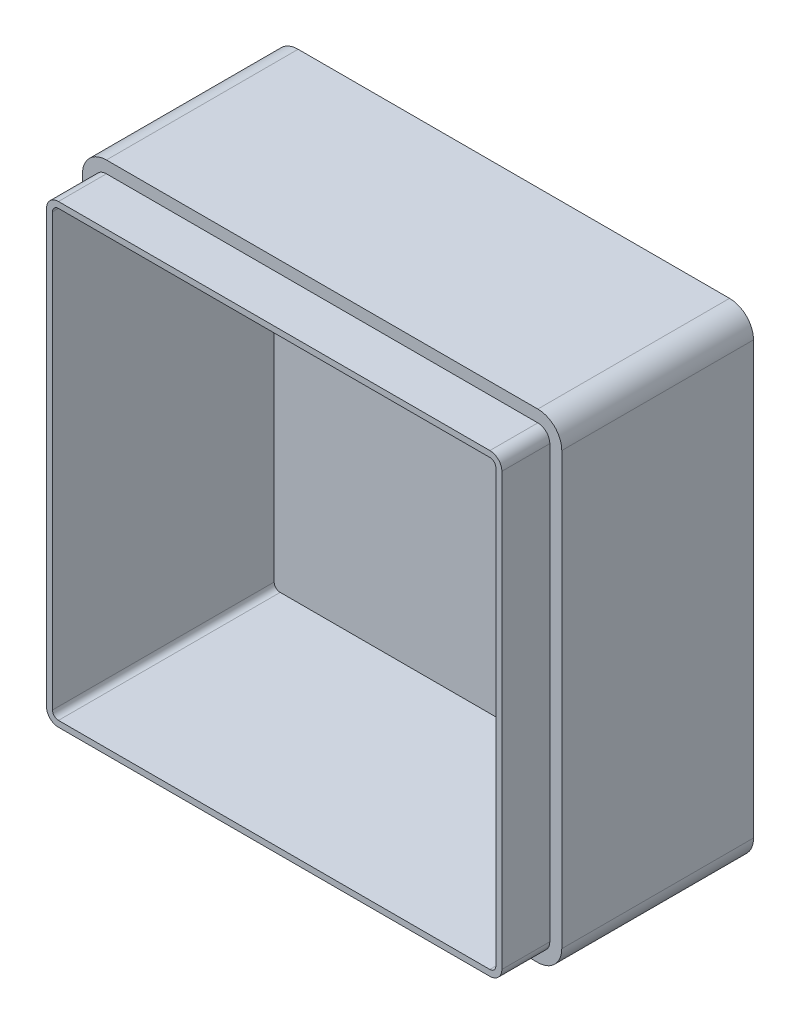
ISO-10303-21;
HEADER;
FILE_DESCRIPTION(('STEP AP214'),'2;1');
FILE_NAME('part.step','',(''),(''),'','','');
FILE_SCHEMA(('AUTOMOTIVE_DESIGN { 1 0 10303 214 1 1 1 1 }'));
ENDSEC;
DATA;
#1=APPLICATION_CONTEXT('core data for automotive mechanical design processes');
#2=APPLICATION_PROTOCOL_DEFINITION('international standard','automotive_design',2000,#1);
#3=PRODUCT_CONTEXT('',#1,'mechanical');
#4=PRODUCT('Part','Part','',(#3));
#5=PRODUCT_RELATED_PRODUCT_CATEGORY('part','',(#4));
#6=PRODUCT_DEFINITION_FORMATION('','',#4);
#7=PRODUCT_DEFINITION_CONTEXT('part definition',#1,'design');
#8=PRODUCT_DEFINITION('design','',#6,#7);
#9=PRODUCT_DEFINITION_SHAPE('','',#8);
#10=(LENGTH_UNIT() NAMED_UNIT(*) SI_UNIT(.MILLI.,.METRE.));
#11=(NAMED_UNIT(*) PLANE_ANGLE_UNIT() SI_UNIT($,.RADIAN.));
#12=(NAMED_UNIT(*) SI_UNIT($,.STERADIAN.) SOLID_ANGLE_UNIT());
#13=UNCERTAINTY_MEASURE_WITH_UNIT(LENGTH_MEASURE(1.E-05),#10,'distance_accuracy_value','');
#14=(GEOMETRIC_REPRESENTATION_CONTEXT(3) GLOBAL_UNCERTAINTY_ASSIGNED_CONTEXT((#13)) GLOBAL_UNIT_ASSIGNED_CONTEXT((#10,
#11,#12)) REPRESENTATION_CONTEXT('',''));
#15=CARTESIAN_POINT('',(0.,0.,0.));
#16=DIRECTION('',(0.,0.,1.));
#17=DIRECTION('',(1.,0.,0.));
#18=AXIS2_PLACEMENT_3D('',#15,#16,#17);
#19=CARTESIAN_POINT('',(0.,254.,127.));
#20=DIRECTION('',(0.,0.,-1.));
#21=DIRECTION('',(-1.,0.,0.));
#22=AXIS2_PLACEMENT_3D('',#19,#20,#21);
#23=PLANE('',#22);
#24=DIRECTION('',(0.,-1.,0.));
#25=VECTOR('',#24,1.);
#26=CARTESIAN_POINT('',(9.52499999999994,254.,127.));
#27=LINE('',#26,#25);
#28=CARTESIAN_POINT('',(9.52499999999995,241.3,127.));
#29=VERTEX_POINT('',#28);
#30=CARTESIAN_POINT('',(9.525,12.7,127.));
#31=VERTEX_POINT('',#30);
#32=EDGE_CURVE('E615',#29,#31,#27,.T.);
#33=ORIENTED_EDGE('',*,*,#32,.F.);
#34=CARTESIAN_POINT('',(12.6999999999999,241.3,127.));
#35=DIRECTION('',(0.,0.,-1.));
#36=DIRECTION('',(-1.,0.,0.));
#37=AXIS2_PLACEMENT_3D('',#34,#35,#36);
#38=CIRCLE('',#37,3.175);
#39=CARTESIAN_POINT('',(12.6999999999999,244.475,127.));
#40=VERTEX_POINT('',#39);
#41=EDGE_CURVE('E598',#40,#29,#38,.F.);
#42=ORIENTED_EDGE('',*,*,#41,.F.);
#43=DIRECTION('',(-1.,0.,0.));
#44=VECTOR('',#43,1.);
#45=CARTESIAN_POINT('',(0.,244.475,127.));
#46=LINE('',#45,#44);
#47=CARTESIAN_POINT('',(241.3,244.475,127.));
#48=VERTEX_POINT('',#47);
#49=EDGE_CURVE('E624',#48,#40,#46,.T.);
#50=ORIENTED_EDGE('',*,*,#49,.F.);
#51=CARTESIAN_POINT('',(241.3,241.3,127.));
#52=DIRECTION('',(0.,0.,-1.));
#53=DIRECTION('',(-1.,0.,0.));
#54=AXIS2_PLACEMENT_3D('',#51,#52,#53);
#55=CIRCLE('',#54,3.175);
#56=CARTESIAN_POINT('',(244.475,241.3,127.));
#57=VERTEX_POINT('',#56);
#58=EDGE_CURVE('E647',#57,#48,#55,.F.);
#59=ORIENTED_EDGE('',*,*,#58,.F.);
#60=DIRECTION('',(0.,1.,0.));
#61=VECTOR('',#60,1.);
#62=CARTESIAN_POINT('',(244.475,254.,127.));
#63=LINE('',#62,#61);
#64=CARTESIAN_POINT('',(244.475,12.7,127.));
#65=VERTEX_POINT('',#64);
#66=EDGE_CURVE('E645',#65,#57,#63,.T.);
#67=ORIENTED_EDGE('',*,*,#66,.F.);
#68=CARTESIAN_POINT('',(241.3,12.7,127.));
#69=DIRECTION('',(0.,0.,-1.));
#70=DIRECTION('',(-1.,0.,0.));
#71=AXIS2_PLACEMENT_3D('',#68,#69,#70);
#72=CIRCLE('',#71,3.175);
#73=CARTESIAN_POINT('',(241.3,9.525,127.));
#74=VERTEX_POINT('',#73);
#75=EDGE_CURVE('E642',#74,#65,#72,.F.);
#76=ORIENTED_EDGE('',*,*,#75,.F.);
#77=DIRECTION('',(1.,0.,0.));
#78=VECTOR('',#77,1.);
#79=CARTESIAN_POINT('',(0.,9.52500000000001,127.));
#80=LINE('',#79,#78);
#81=CARTESIAN_POINT('',(12.7,9.525,127.));
#82=VERTEX_POINT('',#81);
#83=EDGE_CURVE('E640',#82,#74,#80,.T.);
#84=ORIENTED_EDGE('',*,*,#83,.F.);
#85=CARTESIAN_POINT('',(12.7,12.7,127.));
#86=DIRECTION('',(0.,0.,-1.));
#87=DIRECTION('',(-1.,0.,0.));
#88=AXIS2_PLACEMENT_3D('',#85,#86,#87);
#89=CIRCLE('',#88,3.175);
#90=EDGE_CURVE('E631',#31,#82,#89,.F.);
#91=ORIENTED_EDGE('',*,*,#90,.F.);
#92=EDGE_LOOP('',(#33,#42,#50,#59,#67,#76,#84,#91));
#93=FACE_BOUND('',#92,.T.);
#94=CARTESIAN_POINT('',(12.6999999999999,241.3,127.));
#95=DIRECTION('',(0.,0.,1.));
#96=DIRECTION('',(1.,0.,0.));
#97=AXIS2_PLACEMENT_3D('',#94,#95,#96);
#98=CIRCLE('',#97,6.35);
#99=CARTESIAN_POINT('',(12.6999999999999,247.65,127.));
#100=VERTEX_POINT('',#99);
#101=CARTESIAN_POINT('',(6.34999999999995,241.3,127.));
#102=VERTEX_POINT('',#101);
#103=EDGE_CURVE('E530',#100,#102,#98,.T.);
#104=ORIENTED_EDGE('',*,*,#103,.T.);
#105=DIRECTION('',(0.,-1.,0.));
#106=VECTOR('',#105,1.);
#107=CARTESIAN_POINT('',(6.34999999999995,241.3,127.));
#108=LINE('',#107,#106);
#109=CARTESIAN_POINT('',(6.35,12.7,127.));
#110=VERTEX_POINT('',#109);
#111=EDGE_CURVE('E528',#102,#110,#108,.T.);
#112=ORIENTED_EDGE('',*,*,#111,.T.);
#113=CARTESIAN_POINT('',(12.7,12.7,127.));
#114=DIRECTION('',(0.,0.,1.));
#115=DIRECTION('',(1.,0.,0.));
#116=AXIS2_PLACEMENT_3D('',#113,#114,#115);
#117=CIRCLE('',#116,6.35);
#118=CARTESIAN_POINT('',(12.7,6.35,127.));
#119=VERTEX_POINT('',#118);
#120=EDGE_CURVE('E363',#110,#119,#117,.T.);
#121=ORIENTED_EDGE('',*,*,#120,.T.);
#122=DIRECTION('',(1.,0.,0.));
#123=VECTOR('',#122,1.);
#124=CARTESIAN_POINT('',(12.7,6.35,127.));
#125=LINE('',#124,#123);
#126=CARTESIAN_POINT('',(241.3,6.35,127.));
#127=VERTEX_POINT('',#126);
#128=EDGE_CURVE('E518',#119,#127,#125,.T.);
#129=ORIENTED_EDGE('',*,*,#128,.T.);
#130=CARTESIAN_POINT('',(241.3,12.7,127.));
#131=DIRECTION('',(0.,0.,1.));
#132=DIRECTION('',(1.,0.,0.));
#133=AXIS2_PLACEMENT_3D('',#130,#131,#132);
#134=CIRCLE('',#133,6.35);
#135=CARTESIAN_POINT('',(247.65,12.7,127.));
#136=VERTEX_POINT('',#135);
#137=EDGE_CURVE('E523',#127,#136,#134,.T.);
#138=ORIENTED_EDGE('',*,*,#137,.T.);
#139=DIRECTION('',(0.,1.,0.));
#140=VECTOR('',#139,1.);
#141=CARTESIAN_POINT('',(247.65,12.7,127.));
#142=LINE('',#141,#140);
#143=CARTESIAN_POINT('',(247.65,241.3,127.));
#144=VERTEX_POINT('',#143);
#145=EDGE_CURVE('E535',#136,#144,#142,.T.);
#146=ORIENTED_EDGE('',*,*,#145,.T.);
#147=CARTESIAN_POINT('',(241.3,241.3,127.));
#148=DIRECTION('',(0.,0.,1.));
#149=DIRECTION('',(1.,0.,0.));
#150=AXIS2_PLACEMENT_3D('',#147,#148,#149);
#151=CIRCLE('',#150,6.34999999999999);
#152=CARTESIAN_POINT('',(241.3,247.65,127.));
#153=VERTEX_POINT('',#152);
#154=EDGE_CURVE('E538',#144,#153,#151,.T.);
#155=ORIENTED_EDGE('',*,*,#154,.T.);
#156=DIRECTION('',(-1.,0.,0.));
#157=VECTOR('',#156,1.);
#158=CARTESIAN_POINT('',(241.3,247.65,127.));
#159=LINE('',#158,#157);
#160=EDGE_CURVE('E541',#153,#100,#159,.T.);
#161=ORIENTED_EDGE('',*,*,#160,.T.);
#162=EDGE_LOOP('',(#104,#112,#121,#129,#138,#146,#155,#161));
#163=FACE_BOUND('',#162,.T.);
#164=ADVANCED_FACE('F348',(#93,#163),#23,.F.);
#165=CARTESIAN_POINT('',(9.525,0.,127.));
#166=DIRECTION('',(1.,0.,0.));
#167=DIRECTION('',(0.,1.,0.));
#168=AXIS2_PLACEMENT_3D('',#165,#166,#167);
#169=PLANE('',#168);
#170=DIRECTION('',(0.,-1.,0.));
#171=VECTOR('',#170,1.);
#172=CARTESIAN_POINT('',(9.52499999999994,254.,9.525));
#173=LINE('',#172,#171);
#174=CARTESIAN_POINT('',(9.52499999999995,241.3,9.52500000000001));
#175=VERTEX_POINT('',#174);
#176=CARTESIAN_POINT('',(9.525,12.7,9.52500000000001));
#177=VERTEX_POINT('',#176);
#178=EDGE_CURVE('E592',#175,#177,#173,.T.);
#179=ORIENTED_EDGE('',*,*,#178,.F.);
#180=DIRECTION('',(0.,0.,1.));
#181=VECTOR('',#180,1.);
#182=CARTESIAN_POINT('',(9.52499999999995,241.3,127.));
#183=LINE('',#182,#181);
#184=EDGE_CURVE('E599',#29,#175,#183,.F.);
#185=ORIENTED_EDGE('',*,*,#184,.F.);
#186=ORIENTED_EDGE('',*,*,#32,.T.);
#187=DIRECTION('',(0.,0.,1.));
#188=VECTOR('',#187,1.);
#189=CARTESIAN_POINT('',(9.525,12.7,127.));
#190=LINE('',#189,#188);
#191=EDGE_CURVE('E596',#177,#31,#190,.T.);
#192=ORIENTED_EDGE('',*,*,#191,.F.);
#193=EDGE_LOOP('',(#179,#185,#186,#192));
#194=FACE_BOUND('',#193,.T.);
#195=ADVANCED_FACE('F741',(#194),#169,.T.);
#196=CARTESIAN_POINT('',(0.,9.525,127.));
#197=DIRECTION('',(0.,1.,0.));
#198=DIRECTION('',(0.,0.,1.));
#199=AXIS2_PLACEMENT_3D('',#196,#197,#198);
#200=PLANE('',#199);
#201=ORIENTED_EDGE('',*,*,#83,.T.);
#202=DIRECTION('',(0.,0.,1.));
#203=VECTOR('',#202,1.);
#204=CARTESIAN_POINT('',(241.3,9.525,127.));
#205=LINE('',#204,#203);
#206=CARTESIAN_POINT('',(241.3,9.525,9.52500000000001));
#207=VERTEX_POINT('',#206);
#208=EDGE_CURVE('E622',#207,#74,#205,.T.);
#209=ORIENTED_EDGE('',*,*,#208,.F.);
#210=DIRECTION('',(1.,0.,0.));
#211=VECTOR('',#210,1.);
#212=CARTESIAN_POINT('',(0.,9.52500000000001,9.525));
#213=LINE('',#212,#211);
#214=CARTESIAN_POINT('',(12.7,9.525,9.52500000000001));
#215=VERTEX_POINT('',#214);
#216=EDGE_CURVE('E595',#215,#207,#213,.T.);
#217=ORIENTED_EDGE('',*,*,#216,.F.);
#218=DIRECTION('',(0.,0.,1.));
#219=VECTOR('',#218,1.);
#220=CARTESIAN_POINT('',(12.7,9.525,127.));
#221=LINE('',#220,#219);
#222=EDGE_CURVE('E611',#82,#215,#221,.F.);
#223=ORIENTED_EDGE('',*,*,#222,.F.);
#224=EDGE_LOOP('',(#201,#209,#217,#223));
#225=FACE_BOUND('',#224,.T.);
#226=ADVANCED_FACE('F747',(#225),#200,.T.);
#227=CARTESIAN_POINT('',(244.475,0.,127.));
#228=DIRECTION('',(-1.,0.,0.));
#229=DIRECTION('',(0.,-1.,0.));
#230=AXIS2_PLACEMENT_3D('',#227,#228,#229);
#231=PLANE('',#230);
#232=ORIENTED_EDGE('',*,*,#66,.T.);
#233=DIRECTION('',(0.,0.,1.));
#234=VECTOR('',#233,1.);
#235=CARTESIAN_POINT('',(244.475,241.3,127.));
#236=LINE('',#235,#234);
#237=CARTESIAN_POINT('',(244.475,241.3,9.52500000000001));
#238=VERTEX_POINT('',#237);
#239=EDGE_CURVE('E629',#238,#57,#236,.T.);
#240=ORIENTED_EDGE('',*,*,#239,.F.);
#241=DIRECTION('',(0.,1.,0.));
#242=VECTOR('',#241,1.);
#243=CARTESIAN_POINT('',(244.475,254.,9.525));
#244=LINE('',#243,#242);
#245=CARTESIAN_POINT('',(244.475,12.7,9.52500000000001));
#246=VERTEX_POINT('',#245);
#247=EDGE_CURVE('E605',#246,#238,#244,.T.);
#248=ORIENTED_EDGE('',*,*,#247,.F.);
#249=DIRECTION('',(0.,0.,1.));
#250=VECTOR('',#249,1.);
#251=CARTESIAN_POINT('',(244.475,12.7,127.));
#252=LINE('',#251,#250);
#253=EDGE_CURVE('E625',#65,#246,#252,.F.);
#254=ORIENTED_EDGE('',*,*,#253,.F.);
#255=EDGE_LOOP('',(#232,#240,#248,#254));
#256=FACE_BOUND('',#255,.T.);
#257=ADVANCED_FACE('F789',(#256),#231,.T.);
#258=CARTESIAN_POINT('',(0.,244.475,127.));
#259=DIRECTION('',(0.,-1.,0.));
#260=DIRECTION('',(0.,0.,-1.));
#261=AXIS2_PLACEMENT_3D('',#258,#259,#260);
#262=PLANE('',#261);
#263=ORIENTED_EDGE('',*,*,#49,.T.);
#264=DIRECTION('',(0.,0.,-1.));
#265=VECTOR('',#264,1.);
#266=CARTESIAN_POINT('',(12.6999999999999,244.475,127.));
#267=LINE('',#266,#265);
#268=CARTESIAN_POINT('',(12.6999999999999,244.475,9.52500000000001));
#269=VERTEX_POINT('',#268);
#270=EDGE_CURVE('E628',#269,#40,#267,.F.);
#271=ORIENTED_EDGE('',*,*,#270,.F.);
#272=DIRECTION('',(-1.,0.,0.));
#273=VECTOR('',#272,1.);
#274=CARTESIAN_POINT('',(0.,244.475,9.525));
#275=LINE('',#274,#273);
#276=CARTESIAN_POINT('',(241.3,244.475,9.52500000000001));
#277=VERTEX_POINT('',#276);
#278=EDGE_CURVE('E612',#277,#269,#275,.T.);
#279=ORIENTED_EDGE('',*,*,#278,.F.);
#280=DIRECTION('',(0.,0.,-1.));
#281=VECTOR('',#280,1.);
#282=CARTESIAN_POINT('',(241.3,244.475,127.));
#283=LINE('',#282,#281);
#284=EDGE_CURVE('E632',#48,#277,#283,.T.);
#285=ORIENTED_EDGE('',*,*,#284,.F.);
#286=EDGE_LOOP('',(#263,#271,#279,#285));
#287=FACE_BOUND('',#286,.T.);
#288=ADVANCED_FACE('F785',(#287),#262,.T.);
#289=CARTESIAN_POINT('',(0.,254.,9.525));
#290=DIRECTION('',(0.,0.,-1.));
#291=DIRECTION('',(-1.,0.,0.));
#292=AXIS2_PLACEMENT_3D('',#289,#290,#291);
#293=PLANE('',#292);
#294=ORIENTED_EDGE('',*,*,#216,.T.);
#295=CARTESIAN_POINT('',(241.3,12.7,9.52500000000001));
#296=DIRECTION('',(0.,0.,-1.));
#297=DIRECTION('',(-1.,0.,0.));
#298=AXIS2_PLACEMENT_3D('',#295,#296,#297);
#299=CIRCLE('',#298,3.175);
#300=EDGE_CURVE('E607',#246,#207,#299,.T.);
#301=ORIENTED_EDGE('',*,*,#300,.F.);
#302=ORIENTED_EDGE('',*,*,#247,.T.);
#303=CARTESIAN_POINT('',(241.3,241.3,9.52500000000001));
#304=DIRECTION('',(0.,0.,-1.));
#305=DIRECTION('',(-1.,0.,0.));
#306=AXIS2_PLACEMENT_3D('',#303,#304,#305);
#307=CIRCLE('',#306,3.175);
#308=EDGE_CURVE('E610',#277,#238,#307,.T.);
#309=ORIENTED_EDGE('',*,*,#308,.F.);
#310=ORIENTED_EDGE('',*,*,#278,.T.);
#311=CARTESIAN_POINT('',(12.6999999999999,241.3,9.52500000000001));
#312=DIRECTION('',(0.,0.,-1.));
#313=DIRECTION('',(-1.,0.,0.));
#314=AXIS2_PLACEMENT_3D('',#311,#312,#313);
#315=CIRCLE('',#314,3.175);
#316=EDGE_CURVE('E608',#175,#269,#315,.T.);
#317=ORIENTED_EDGE('',*,*,#316,.F.);
#318=ORIENTED_EDGE('',*,*,#178,.T.);
#319=CARTESIAN_POINT('',(12.7,12.7,9.52500000000001));
#320=DIRECTION('',(0.,0.,-1.));
#321=DIRECTION('',(-1.,0.,0.));
#322=AXIS2_PLACEMENT_3D('',#319,#320,#321);
#323=CIRCLE('',#322,3.175);
#324=EDGE_CURVE('E602',#215,#177,#323,.T.);
#325=ORIENTED_EDGE('',*,*,#324,.F.);
#326=EDGE_LOOP('',(#294,#301,#302,#309,#310,#317,#318,#325));
#327=FACE_BOUND('',#326,.T.);
#328=ADVANCED_FACE('F781',(#327),#293,.F.);
#329=CARTESIAN_POINT('',(12.7,12.7,127.));
#330=DIRECTION('',(0.,0.,-1.));
#331=DIRECTION('',(-1.,0.,0.));
#332=AXIS2_PLACEMENT_3D('',#329,#330,#331);
#333=CYLINDRICAL_SURFACE('',#332,3.175);
#334=ORIENTED_EDGE('',*,*,#90,.T.);
#335=ORIENTED_EDGE('',*,*,#222,.T.);
#336=ORIENTED_EDGE('',*,*,#324,.T.);
#337=ORIENTED_EDGE('',*,*,#191,.T.);
#338=EDGE_LOOP('',(#334,#335,#336,#337));
#339=FACE_BOUND('',#338,.T.);
#340=ADVANCED_FACE('F777',(#339),#333,.F.);
#341=CARTESIAN_POINT('',(241.3,12.7,127.));
#342=DIRECTION('',(0.,0.,-1.));
#343=DIRECTION('',(-1.,0.,0.));
#344=AXIS2_PLACEMENT_3D('',#341,#342,#343);
#345=CYLINDRICAL_SURFACE('',#344,3.175);
#346=ORIENTED_EDGE('',*,*,#75,.T.);
#347=ORIENTED_EDGE('',*,*,#253,.T.);
#348=ORIENTED_EDGE('',*,*,#300,.T.);
#349=ORIENTED_EDGE('',*,*,#208,.T.);
#350=EDGE_LOOP('',(#346,#347,#348,#349));
#351=FACE_BOUND('',#350,.T.);
#352=ADVANCED_FACE('F773',(#351),#345,.F.);
#353=CARTESIAN_POINT('',(241.3,241.3,127.));
#354=DIRECTION('',(0.,0.,-1.));
#355=DIRECTION('',(-1.,0.,0.));
#356=AXIS2_PLACEMENT_3D('',#353,#354,#355);
#357=CYLINDRICAL_SURFACE('',#356,3.175);
#358=ORIENTED_EDGE('',*,*,#58,.T.);
#359=ORIENTED_EDGE('',*,*,#284,.T.);
#360=ORIENTED_EDGE('',*,*,#308,.T.);
#361=ORIENTED_EDGE('',*,*,#239,.T.);
#362=EDGE_LOOP('',(#358,#359,#360,#361));
#363=FACE_BOUND('',#362,.T.);
#364=ADVANCED_FACE('F769',(#363),#357,.F.);
#365=CARTESIAN_POINT('',(12.6999999999999,241.3,127.));
#366=DIRECTION('',(0.,0.,-1.));
#367=DIRECTION('',(-1.,0.,0.));
#368=AXIS2_PLACEMENT_3D('',#365,#366,#367);
#369=CYLINDRICAL_SURFACE('',#368,3.175);
#370=ORIENTED_EDGE('',*,*,#41,.T.);
#371=ORIENTED_EDGE('',*,*,#184,.T.);
#372=ORIENTED_EDGE('',*,*,#316,.T.);
#373=ORIENTED_EDGE('',*,*,#270,.T.);
#374=EDGE_LOOP('',(#370,#371,#372,#373));
#375=FACE_BOUND('',#374,.T.);
#376=ADVANCED_FACE('F767',(#375),#369,.F.);
#377=CARTESIAN_POINT('',(12.6999999999999,241.3,101.6));
#378=DIRECTION('',(0.,0.,1.));
#379=DIRECTION('',(1.,0.,0.));
#380=AXIS2_PLACEMENT_3D('',#377,#378,#379);
#381=PLANE('',#380);
#382=DIRECTION('',(-1.,0.,0.));
#383=VECTOR('',#382,1.);
#384=CARTESIAN_POINT('',(241.3,247.65,101.6));
#385=LINE('',#384,#383);
#386=CARTESIAN_POINT('',(241.3,247.65,101.6));
#387=VERTEX_POINT('',#386);
#388=CARTESIAN_POINT('',(12.6999999999999,247.65,101.6));
#389=VERTEX_POINT('',#388);
#390=EDGE_CURVE('E562',#387,#389,#385,.T.);
#391=ORIENTED_EDGE('',*,*,#390,.F.);
#392=CARTESIAN_POINT('',(241.3,241.3,101.6));
#393=DIRECTION('',(0.,0.,1.));
#394=DIRECTION('',(1.,0.,0.));
#395=AXIS2_PLACEMENT_3D('',#392,#393,#394);
#396=CIRCLE('',#395,6.34999999999999);
#397=CARTESIAN_POINT('',(247.65,241.3,101.6));
#398=VERTEX_POINT('',#397);
#399=EDGE_CURVE('E559',#398,#387,#396,.T.);
#400=ORIENTED_EDGE('',*,*,#399,.F.);
#401=DIRECTION('',(0.,1.,0.));
#402=VECTOR('',#401,1.);
#403=CARTESIAN_POINT('',(247.65,12.7,101.6));
#404=LINE('',#403,#402);
#405=CARTESIAN_POINT('',(247.65,12.7,101.6));
#406=VERTEX_POINT('',#405);
#407=EDGE_CURVE('E556',#406,#398,#404,.T.);
#408=ORIENTED_EDGE('',*,*,#407,.F.);
#409=CARTESIAN_POINT('',(241.3,12.7,101.6));
#410=DIRECTION('',(0.,0.,1.));
#411=DIRECTION('',(1.,0.,0.));
#412=AXIS2_PLACEMENT_3D('',#409,#410,#411);
#413=CIRCLE('',#412,6.35);
#414=CARTESIAN_POINT('',(241.3,6.35,101.6));
#415=VERTEX_POINT('',#414);
#416=EDGE_CURVE('E553',#415,#406,#413,.T.);
#417=ORIENTED_EDGE('',*,*,#416,.F.);
#418=DIRECTION('',(1.,0.,0.));
#419=VECTOR('',#418,1.);
#420=CARTESIAN_POINT('',(12.7,6.35,101.6));
#421=LINE('',#420,#419);
#422=CARTESIAN_POINT('',(12.7,6.35,101.6));
#423=VERTEX_POINT('',#422);
#424=EDGE_CURVE('E551',#423,#415,#421,.T.);
#425=ORIENTED_EDGE('',*,*,#424,.F.);
#426=CARTESIAN_POINT('',(12.7,12.7,101.6));
#427=DIRECTION('',(0.,0.,1.));
#428=DIRECTION('',(1.,0.,0.));
#429=AXIS2_PLACEMENT_3D('',#426,#427,#428);
#430=CIRCLE('',#429,6.35);
#431=CARTESIAN_POINT('',(6.35,12.7,101.6));
#432=VERTEX_POINT('',#431);
#433=EDGE_CURVE('E510',#432,#423,#430,.T.);
#434=ORIENTED_EDGE('',*,*,#433,.F.);
#435=DIRECTION('',(0.,-1.,0.));
#436=VECTOR('',#435,1.);
#437=CARTESIAN_POINT('',(6.34999999999995,241.3,101.6));
#438=LINE('',#437,#436);
#439=CARTESIAN_POINT('',(6.34999999999995,241.3,101.6));
#440=VERTEX_POINT('',#439);
#441=EDGE_CURVE('E547',#440,#432,#438,.T.);
#442=ORIENTED_EDGE('',*,*,#441,.F.);
#443=CARTESIAN_POINT('',(12.6999999999999,241.3,101.6));
#444=DIRECTION('',(0.,0.,1.));
#445=DIRECTION('',(1.,0.,0.));
#446=AXIS2_PLACEMENT_3D('',#443,#444,#445);
#447=CIRCLE('',#446,6.35);
#448=EDGE_CURVE('E544',#389,#440,#447,.T.);
#449=ORIENTED_EDGE('',*,*,#448,.F.);
#450=EDGE_LOOP('',(#391,#400,#408,#417,#425,#434,#442,#449));
#451=FACE_BOUND('',#450,.T.);
#452=CARTESIAN_POINT('',(12.6999999999999,241.3,101.6));
#453=DIRECTION('',(0.,0.,1.));
#454=DIRECTION('',(1.,0.,0.));
#455=AXIS2_PLACEMENT_3D('',#452,#453,#454);
#456=CIRCLE('',#455,12.7);
#457=CARTESIAN_POINT('',(12.6999999999999,254.,101.6));
#458=VERTEX_POINT('',#457);
#459=CARTESIAN_POINT('',(0.,241.3,101.6));
#460=VERTEX_POINT('',#459);
#461=EDGE_CURVE('E568',#458,#460,#456,.T.);
#462=ORIENTED_EDGE('',*,*,#461,.T.);
#463=DIRECTION('',(0.,-1.,0.));
#464=VECTOR('',#463,1.);
#465=CARTESIAN_POINT('',(0.,241.3,101.6));
#466=LINE('',#465,#464);
#467=CARTESIAN_POINT('',(0.,12.7,101.6));
#468=VERTEX_POINT('',#467);
#469=EDGE_CURVE('E579',#460,#468,#466,.T.);
#470=ORIENTED_EDGE('',*,*,#469,.T.);
#471=CARTESIAN_POINT('',(12.7,12.7,101.6));
#472=DIRECTION('',(0.,0.,1.));
#473=DIRECTION('',(1.,0.,0.));
#474=AXIS2_PLACEMENT_3D('',#471,#472,#473);
#475=CIRCLE('',#474,12.7);
#476=CARTESIAN_POINT('',(12.7,0.,101.6));
#477=VERTEX_POINT('',#476);
#478=EDGE_CURVE('E581',#468,#477,#475,.T.);
#479=ORIENTED_EDGE('',*,*,#478,.T.);
#480=DIRECTION('',(1.,0.,0.));
#481=VECTOR('',#480,1.);
#482=CARTESIAN_POINT('',(12.7,0.,101.6));
#483=LINE('',#482,#481);
#484=CARTESIAN_POINT('',(241.3,0.,101.6));
#485=VERTEX_POINT('',#484);
#486=EDGE_CURVE('E583',#477,#485,#483,.T.);
#487=ORIENTED_EDGE('',*,*,#486,.T.);
#488=CARTESIAN_POINT('',(241.3,12.7,101.6));
#489=DIRECTION('',(0.,0.,1.));
#490=DIRECTION('',(1.,0.,0.));
#491=AXIS2_PLACEMENT_3D('',#488,#489,#490);
#492=CIRCLE('',#491,12.7);
#493=CARTESIAN_POINT('',(254.,12.7,101.6));
#494=VERTEX_POINT('',#493);
#495=EDGE_CURVE('E585',#485,#494,#492,.T.);
#496=ORIENTED_EDGE('',*,*,#495,.T.);
#497=DIRECTION('',(0.,1.,0.));
#498=VECTOR('',#497,1.);
#499=CARTESIAN_POINT('',(254.,12.7,101.6));
#500=LINE('',#499,#498);
#501=CARTESIAN_POINT('',(254.,241.3,101.6));
#502=VERTEX_POINT('',#501);
#503=EDGE_CURVE('E587',#494,#502,#500,.T.);
#504=ORIENTED_EDGE('',*,*,#503,.T.);
#505=CARTESIAN_POINT('',(241.3,241.3,101.6));
#506=DIRECTION('',(0.,0.,1.));
#507=DIRECTION('',(1.,0.,0.));
#508=AXIS2_PLACEMENT_3D('',#505,#506,#507);
#509=CIRCLE('',#508,12.7);
#510=CARTESIAN_POINT('',(241.3,254.,101.6));
#511=VERTEX_POINT('',#510);
#512=EDGE_CURVE('E589',#502,#511,#509,.T.);
#513=ORIENTED_EDGE('',*,*,#512,.T.);
#514=DIRECTION('',(-1.,0.,0.));
#515=VECTOR('',#514,1.);
#516=CARTESIAN_POINT('',(241.3,254.,101.6));
#517=LINE('',#516,#515);
#518=EDGE_CURVE('E371',#511,#458,#517,.T.);
#519=ORIENTED_EDGE('',*,*,#518,.T.);
#520=EDGE_LOOP('',(#462,#470,#479,#487,#496,#504,#513,#519));
#521=FACE_BOUND('',#520,.T.);
#522=ADVANCED_FACE('F698',(#451,#521),#381,.T.);
#523=CARTESIAN_POINT('',(12.6999999999999,241.3,101.6));
#524=DIRECTION('',(0.,0.,1.));
#525=DIRECTION('',(1.,0.,0.));
#526=AXIS2_PLACEMENT_3D('',#523,#524,#525);
#527=CYLINDRICAL_SURFACE('',#526,6.35);
#528=ORIENTED_EDGE('',*,*,#103,.F.);
#529=DIRECTION('',(0.,0.,1.));
#530=VECTOR('',#529,1.);
#531=CARTESIAN_POINT('',(12.6999999999999,247.65,101.6));
#532=LINE('',#531,#530);
#533=EDGE_CURVE('E566',#389,#100,#532,.T.);
#534=ORIENTED_EDGE('',*,*,#533,.F.);
#535=ORIENTED_EDGE('',*,*,#448,.T.);
#536=DIRECTION('',(0.,0.,1.));
#537=VECTOR('',#536,1.);
#538=CARTESIAN_POINT('',(6.34999999999995,241.3,101.6));
#539=LINE('',#538,#537);
#540=EDGE_CURVE('E565',#440,#102,#539,.T.);
#541=ORIENTED_EDGE('',*,*,#540,.T.);
#542=EDGE_LOOP('',(#528,#534,#535,#541));
#543=FACE_BOUND('',#542,.T.);
#544=ADVANCED_FACE('F798',(#543),#527,.T.);
#545=CARTESIAN_POINT('',(241.3,247.65,101.6));
#546=DIRECTION('',(0.,1.,0.));
#547=DIRECTION('',(0.,0.,1.));
#548=AXIS2_PLACEMENT_3D('',#545,#546,#547);
#549=PLANE('',#548);
#550=ORIENTED_EDGE('',*,*,#160,.F.);
#551=DIRECTION('',(0.,0.,1.));
#552=VECTOR('',#551,1.);
#553=CARTESIAN_POINT('',(241.3,247.65,101.6));
#554=LINE('',#553,#552);
#555=EDGE_CURVE('E569',#387,#153,#554,.T.);
#556=ORIENTED_EDGE('',*,*,#555,.F.);
#557=ORIENTED_EDGE('',*,*,#390,.T.);
#558=ORIENTED_EDGE('',*,*,#533,.T.);
#559=EDGE_LOOP('',(#550,#556,#557,#558));
#560=FACE_BOUND('',#559,.T.);
#561=ADVANCED_FACE('F801',(#560),#549,.T.);
#562=CARTESIAN_POINT('',(241.3,241.3,101.6));
#563=DIRECTION('',(0.,0.,1.));
#564=DIRECTION('',(1.,0.,0.));
#565=AXIS2_PLACEMENT_3D('',#562,#563,#564);
#566=CYLINDRICAL_SURFACE('',#565,6.34999999999999);
#567=ORIENTED_EDGE('',*,*,#154,.F.);
#568=DIRECTION('',(0.,0.,1.));
#569=VECTOR('',#568,1.);
#570=CARTESIAN_POINT('',(247.65,241.3,101.6));
#571=LINE('',#570,#569);
#572=EDGE_CURVE('E571',#398,#144,#571,.T.);
#573=ORIENTED_EDGE('',*,*,#572,.F.);
#574=ORIENTED_EDGE('',*,*,#399,.T.);
#575=ORIENTED_EDGE('',*,*,#555,.T.);
#576=EDGE_LOOP('',(#567,#573,#574,#575));
#577=FACE_BOUND('',#576,.T.);
#578=ADVANCED_FACE('F815',(#577),#566,.T.);
#579=CARTESIAN_POINT('',(247.65,12.7,101.6));
#580=DIRECTION('',(1.,0.,0.));
#581=DIRECTION('',(0.,1.,0.));
#582=AXIS2_PLACEMENT_3D('',#579,#580,#581);
#583=PLANE('',#582);
#584=ORIENTED_EDGE('',*,*,#145,.F.);
#585=DIRECTION('',(0.,0.,1.));
#586=VECTOR('',#585,1.);
#587=CARTESIAN_POINT('',(247.65,12.7,101.6));
#588=LINE('',#587,#586);
#589=EDGE_CURVE('E573',#406,#136,#588,.T.);
#590=ORIENTED_EDGE('',*,*,#589,.F.);
#591=ORIENTED_EDGE('',*,*,#407,.T.);
#592=ORIENTED_EDGE('',*,*,#572,.T.);
#593=EDGE_LOOP('',(#584,#590,#591,#592));
#594=FACE_BOUND('',#593,.T.);
#595=ADVANCED_FACE('F811',(#594),#583,.T.);
#596=CARTESIAN_POINT('',(241.3,12.7,101.6));
#597=DIRECTION('',(0.,0.,1.));
#598=DIRECTION('',(1.,0.,0.));
#599=AXIS2_PLACEMENT_3D('',#596,#597,#598);
#600=CYLINDRICAL_SURFACE('',#599,6.35);
#601=ORIENTED_EDGE('',*,*,#137,.F.);
#602=DIRECTION('',(0.,0.,1.));
#603=VECTOR('',#602,1.);
#604=CARTESIAN_POINT('',(241.3,6.35,101.6));
#605=LINE('',#604,#603);
#606=EDGE_CURVE('E514',#415,#127,#605,.T.);
#607=ORIENTED_EDGE('',*,*,#606,.F.);
#608=ORIENTED_EDGE('',*,*,#416,.T.);
#609=ORIENTED_EDGE('',*,*,#589,.T.);
#610=EDGE_LOOP('',(#601,#607,#608,#609));
#611=FACE_BOUND('',#610,.T.);
#612=ADVANCED_FACE('F808',(#611),#600,.T.);
#613=CARTESIAN_POINT('',(12.7,6.35,101.6));
#614=DIRECTION('',(0.,-1.,0.));
#615=DIRECTION('',(0.,0.,-1.));
#616=AXIS2_PLACEMENT_3D('',#613,#614,#615);
#617=PLANE('',#616);
#618=ORIENTED_EDGE('',*,*,#128,.F.);
#619=DIRECTION('',(0.,0.,1.));
#620=VECTOR('',#619,1.);
#621=CARTESIAN_POINT('',(12.7,6.35,101.6));
#622=LINE('',#621,#620);
#623=EDGE_CURVE('E507',#423,#119,#622,.T.);
#624=ORIENTED_EDGE('',*,*,#623,.F.);
#625=ORIENTED_EDGE('',*,*,#424,.T.);
#626=ORIENTED_EDGE('',*,*,#606,.T.);
#627=EDGE_LOOP('',(#618,#624,#625,#626));
#628=FACE_BOUND('',#627,.T.);
#629=ADVANCED_FACE('F519',(#628),#617,.T.);
#630=CARTESIAN_POINT('',(12.7,12.7,101.6));
#631=DIRECTION('',(0.,0.,1.));
#632=DIRECTION('',(1.,0.,0.));
#633=AXIS2_PLACEMENT_3D('',#630,#631,#632);
#634=CYLINDRICAL_SURFACE('',#633,6.35);
#635=ORIENTED_EDGE('',*,*,#120,.F.);
#636=DIRECTION('',(0.,0.,1.));
#637=VECTOR('',#636,1.);
#638=CARTESIAN_POINT('',(6.35,12.7,101.6));
#639=LINE('',#638,#637);
#640=EDGE_CURVE('E515',#432,#110,#639,.T.);
#641=ORIENTED_EDGE('',*,*,#640,.F.);
#642=ORIENTED_EDGE('',*,*,#433,.T.);
#643=ORIENTED_EDGE('',*,*,#623,.T.);
#644=EDGE_LOOP('',(#635,#641,#642,#643));
#645=FACE_BOUND('',#644,.T.);
#646=ADVANCED_FACE('F509',(#645),#634,.T.);
#647=CARTESIAN_POINT('',(6.34999999999995,241.3,101.6));
#648=DIRECTION('',(-1.,0.,0.));
#649=DIRECTION('',(0.,-1.,0.));
#650=AXIS2_PLACEMENT_3D('',#647,#648,#649);
#651=PLANE('',#650);
#652=ORIENTED_EDGE('',*,*,#111,.F.);
#653=ORIENTED_EDGE('',*,*,#540,.F.);
#654=ORIENTED_EDGE('',*,*,#441,.T.);
#655=ORIENTED_EDGE('',*,*,#640,.T.);
#656=EDGE_LOOP('',(#652,#653,#654,#655));
#657=FACE_BOUND('',#656,.T.);
#658=ADVANCED_FACE('F728',(#657),#651,.T.);
#659=CARTESIAN_POINT('',(0.,254.,0.));
#660=DIRECTION('',(0.,0.,-1.));
#661=DIRECTION('',(-1.,0.,0.));
#662=AXIS2_PLACEMENT_3D('',#659,#660,#661);
#663=PLANE('',#662);
#664=DIRECTION('',(1.,0.,0.));
#665=VECTOR('',#664,1.);
#666=CARTESIAN_POINT('',(0.,0.,0.));
#667=LINE('',#666,#665);
#668=CARTESIAN_POINT('',(12.7,0.,0.));
#669=VERTEX_POINT('',#668);
#670=CARTESIAN_POINT('',(241.3,0.,0.));
#671=VERTEX_POINT('',#670);
#672=EDGE_CURVE('E655',#669,#671,#667,.T.);
#673=ORIENTED_EDGE('',*,*,#672,.F.);
#674=CARTESIAN_POINT('',(12.7,12.7,0.));
#675=DIRECTION('',(0.,0.,-1.));
#676=DIRECTION('',(-1.,0.,0.));
#677=AXIS2_PLACEMENT_3D('',#674,#675,#676);
#678=CIRCLE('',#677,12.7);
#679=CARTESIAN_POINT('',(0.,12.7,0.));
#680=VERTEX_POINT('',#679);
#681=EDGE_CURVE('E675',#669,#680,#678,.T.);
#682=ORIENTED_EDGE('',*,*,#681,.T.);
#683=DIRECTION('',(0.,-1.,0.));
#684=VECTOR('',#683,1.);
#685=CARTESIAN_POINT('',(0.,0.,0.));
#686=LINE('',#685,#684);
#687=CARTESIAN_POINT('',(0.,241.3,0.));
#688=VERTEX_POINT('',#687);
#689=EDGE_CURVE('E635',#688,#680,#686,.T.);
#690=ORIENTED_EDGE('',*,*,#689,.F.);
#691=CARTESIAN_POINT('',(12.6999999999999,241.3,0.));
#692=DIRECTION('',(0.,0.,-1.));
#693=DIRECTION('',(-1.,0.,0.));
#694=AXIS2_PLACEMENT_3D('',#691,#692,#693);
#695=CIRCLE('',#694,12.7);
#696=CARTESIAN_POINT('',(12.6999999999999,254.,0.));
#697=VERTEX_POINT('',#696);
#698=EDGE_CURVE('E669',#688,#697,#695,.T.);
#699=ORIENTED_EDGE('',*,*,#698,.T.);
#700=DIRECTION('',(-1.,0.,0.));
#701=VECTOR('',#700,1.);
#702=CARTESIAN_POINT('',(0.,254.,0.));
#703=LINE('',#702,#701);
#704=CARTESIAN_POINT('',(241.3,254.,0.));
#705=VERTEX_POINT('',#704);
#706=EDGE_CURVE('E661',#705,#697,#703,.T.);
#707=ORIENTED_EDGE('',*,*,#706,.F.);
#708=CARTESIAN_POINT('',(241.3,241.3,0.));
#709=DIRECTION('',(0.,0.,-1.));
#710=DIRECTION('',(-1.,0.,0.));
#711=AXIS2_PLACEMENT_3D('',#708,#709,#710);
#712=CIRCLE('',#711,12.7);
#713=CARTESIAN_POINT('',(254.,241.3,0.));
#714=VERTEX_POINT('',#713);
#715=EDGE_CURVE('E671',#705,#714,#712,.T.);
#716=ORIENTED_EDGE('',*,*,#715,.T.);
#717=DIRECTION('',(0.,1.,0.));
#718=VECTOR('',#717,1.);
#719=CARTESIAN_POINT('',(254.,0.,0.));
#720=LINE('',#719,#718);
#721=CARTESIAN_POINT('',(254.,12.7,0.));
#722=VERTEX_POINT('',#721);
#723=EDGE_CURVE('E658',#722,#714,#720,.T.);
#724=ORIENTED_EDGE('',*,*,#723,.F.);
#725=CARTESIAN_POINT('',(241.3,12.7,0.));
#726=DIRECTION('',(0.,0.,-1.));
#727=DIRECTION('',(-1.,0.,0.));
#728=AXIS2_PLACEMENT_3D('',#725,#726,#727);
#729=CIRCLE('',#728,12.7);
#730=EDGE_CURVE('E673',#722,#671,#729,.T.);
#731=ORIENTED_EDGE('',*,*,#730,.T.);
#732=EDGE_LOOP('',(#673,#682,#690,#699,#707,#716,#724,#731));
#733=FACE_BOUND('',#732,.T.);
#734=ADVANCED_FACE('F726',(#733),#663,.T.);
#735=CARTESIAN_POINT('',(12.6999999999999,241.3,127.));
#736=DIRECTION('',(0.,0.,-1.));
#737=DIRECTION('',(-1.,0.,0.));
#738=AXIS2_PLACEMENT_3D('',#735,#736,#737);
#739=CYLINDRICAL_SURFACE('',#738,12.7);
#740=DIRECTION('',(0.,0.,-1.));
#741=VECTOR('',#740,1.);
#742=CARTESIAN_POINT('',(0.,241.3,127.));
#743=LINE('',#742,#741);
#744=EDGE_CURVE('E677',#460,#688,#743,.T.);
#745=ORIENTED_EDGE('',*,*,#744,.F.);
#746=ORIENTED_EDGE('',*,*,#461,.F.);
#747=DIRECTION('',(0.,0.,-1.));
#748=VECTOR('',#747,1.);
#749=CARTESIAN_POINT('',(12.6999999999999,254.,127.));
#750=LINE('',#749,#748);
#751=EDGE_CURVE('E356',#697,#458,#750,.F.);
#752=ORIENTED_EDGE('',*,*,#751,.F.);
#753=ORIENTED_EDGE('',*,*,#698,.F.);
#754=EDGE_LOOP('',(#745,#746,#752,#753));
#755=FACE_BOUND('',#754,.T.);
#756=ADVANCED_FACE('F695',(#755),#739,.T.);
#757=CARTESIAN_POINT('',(241.3,241.3,127.));
#758=DIRECTION('',(0.,0.,-1.));
#759=DIRECTION('',(-1.,0.,0.));
#760=AXIS2_PLACEMENT_3D('',#757,#758,#759);
#761=CYLINDRICAL_SURFACE('',#760,12.7);
#762=DIRECTION('',(0.,0.,-1.));
#763=VECTOR('',#762,1.);
#764=CARTESIAN_POINT('',(241.3,254.,127.));
#765=LINE('',#764,#763);
#766=EDGE_CURVE('E11',#511,#705,#765,.T.);
#767=ORIENTED_EDGE('',*,*,#766,.F.);
#768=ORIENTED_EDGE('',*,*,#512,.F.);
#769=DIRECTION('',(0.,0.,-1.));
#770=VECTOR('',#769,1.);
#771=CARTESIAN_POINT('',(254.,241.3,127.));
#772=LINE('',#771,#770);
#773=EDGE_CURVE('E682',#714,#502,#772,.F.);
#774=ORIENTED_EDGE('',*,*,#773,.F.);
#775=ORIENTED_EDGE('',*,*,#715,.F.);
#776=EDGE_LOOP('',(#767,#768,#774,#775));
#777=FACE_BOUND('',#776,.T.);
#778=ADVANCED_FACE('F724',(#777),#761,.T.);
#779=CARTESIAN_POINT('',(0.,254.,127.));
#780=DIRECTION('',(0.,-1.,0.));
#781=DIRECTION('',(0.,0.,-1.));
#782=AXIS2_PLACEMENT_3D('',#779,#780,#781);
#783=PLANE('',#782);
#784=ORIENTED_EDGE('',*,*,#518,.F.);
#785=ORIENTED_EDGE('',*,*,#766,.T.);
#786=ORIENTED_EDGE('',*,*,#706,.T.);
#787=ORIENTED_EDGE('',*,*,#751,.T.);
#788=EDGE_LOOP('',(#784,#785,#786,#787));
#789=FACE_BOUND('',#788,.T.);
#790=ADVANCED_FACE('F689',(#789),#783,.F.);
#791=CARTESIAN_POINT('',(241.3,12.7,127.));
#792=DIRECTION('',(0.,0.,-1.));
#793=DIRECTION('',(-1.,0.,0.));
#794=AXIS2_PLACEMENT_3D('',#791,#792,#793);
#795=CYLINDRICAL_SURFACE('',#794,12.7);
#796=DIRECTION('',(0.,0.,-1.));
#797=VECTOR('',#796,1.);
#798=CARTESIAN_POINT('',(254.,12.7,127.));
#799=LINE('',#798,#797);
#800=EDGE_CURVE('E685',#494,#722,#799,.T.);
#801=ORIENTED_EDGE('',*,*,#800,.F.);
#802=ORIENTED_EDGE('',*,*,#495,.F.);
#803=DIRECTION('',(0.,0.,-1.));
#804=VECTOR('',#803,1.);
#805=CARTESIAN_POINT('',(241.3,0.,127.));
#806=LINE('',#805,#804);
#807=EDGE_CURVE('E664',#671,#485,#806,.F.);
#808=ORIENTED_EDGE('',*,*,#807,.F.);
#809=ORIENTED_EDGE('',*,*,#730,.F.);
#810=EDGE_LOOP('',(#801,#802,#808,#809));
#811=FACE_BOUND('',#810,.T.);
#812=ADVANCED_FACE('F715',(#811),#795,.T.);
#813=CARTESIAN_POINT('',(254.,0.,127.));
#814=DIRECTION('',(-1.,0.,0.));
#815=DIRECTION('',(0.,-1.,0.));
#816=AXIS2_PLACEMENT_3D('',#813,#814,#815);
#817=PLANE('',#816);
#818=ORIENTED_EDGE('',*,*,#503,.F.);
#819=ORIENTED_EDGE('',*,*,#800,.T.);
#820=ORIENTED_EDGE('',*,*,#723,.T.);
#821=ORIENTED_EDGE('',*,*,#773,.T.);
#822=EDGE_LOOP('',(#818,#819,#820,#821));
#823=FACE_BOUND('',#822,.T.);
#824=ADVANCED_FACE('F720',(#823),#817,.F.);
#825=CARTESIAN_POINT('',(12.7,12.7,127.));
#826=DIRECTION('',(0.,0.,-1.));
#827=DIRECTION('',(-1.,0.,0.));
#828=AXIS2_PLACEMENT_3D('',#825,#826,#827);
#829=CYLINDRICAL_SURFACE('',#828,12.7);
#830=DIRECTION('',(0.,0.,-1.));
#831=VECTOR('',#830,1.);
#832=CARTESIAN_POINT('',(12.7,0.,127.));
#833=LINE('',#832,#831);
#834=EDGE_CURVE('E667',#477,#669,#833,.T.);
#835=ORIENTED_EDGE('',*,*,#834,.F.);
#836=ORIENTED_EDGE('',*,*,#478,.F.);
#837=DIRECTION('',(0.,0.,-1.));
#838=VECTOR('',#837,1.);
#839=CARTESIAN_POINT('',(0.,12.7,127.));
#840=LINE('',#839,#838);
#841=EDGE_CURVE('E679',#680,#468,#840,.F.);
#842=ORIENTED_EDGE('',*,*,#841,.F.);
#843=ORIENTED_EDGE('',*,*,#681,.F.);
#844=EDGE_LOOP('',(#835,#836,#842,#843));
#845=FACE_BOUND('',#844,.T.);
#846=ADVANCED_FACE('F705',(#845),#829,.T.);
#847=CARTESIAN_POINT('',(0.,0.,127.));
#848=DIRECTION('',(0.,1.,0.));
#849=DIRECTION('',(0.,0.,1.));
#850=AXIS2_PLACEMENT_3D('',#847,#848,#849);
#851=PLANE('',#850);
#852=ORIENTED_EDGE('',*,*,#486,.F.);
#853=ORIENTED_EDGE('',*,*,#834,.T.);
#854=ORIENTED_EDGE('',*,*,#672,.T.);
#855=ORIENTED_EDGE('',*,*,#807,.T.);
#856=EDGE_LOOP('',(#852,#853,#854,#855));
#857=FACE_BOUND('',#856,.T.);
#858=ADVANCED_FACE('F710',(#857),#851,.F.);
#859=CARTESIAN_POINT('',(0.,0.,127.));
#860=DIRECTION('',(1.,0.,0.));
#861=DIRECTION('',(0.,1.,0.));
#862=AXIS2_PLACEMENT_3D('',#859,#860,#861);
#863=PLANE('',#862);
#864=ORIENTED_EDGE('',*,*,#469,.F.);
#865=ORIENTED_EDGE('',*,*,#744,.T.);
#866=ORIENTED_EDGE('',*,*,#689,.T.);
#867=ORIENTED_EDGE('',*,*,#841,.T.);
#868=EDGE_LOOP('',(#864,#865,#866,#867));
#869=FACE_BOUND('',#868,.T.);
#870=ADVANCED_FACE('F350',(#869),#863,.F.);
#871=CLOSED_SHELL('',(#164,#195,#226,#257,#288,#328,#340,#352,#364,#376,#522,#544,#561,#578,
#595,#612,#629,#646,#658,#734,#756,#778,#790,#812,#824,#846,#858,#870));
#872=MANIFOLD_SOLID_BREP('B2',#871);
#873=ADVANCED_BREP_SHAPE_REPRESENTATION('',(#18,#872),#14);
#874=SHAPE_DEFINITION_REPRESENTATION(#9,#873);
ENDSEC;
END-ISO-10303-21;
